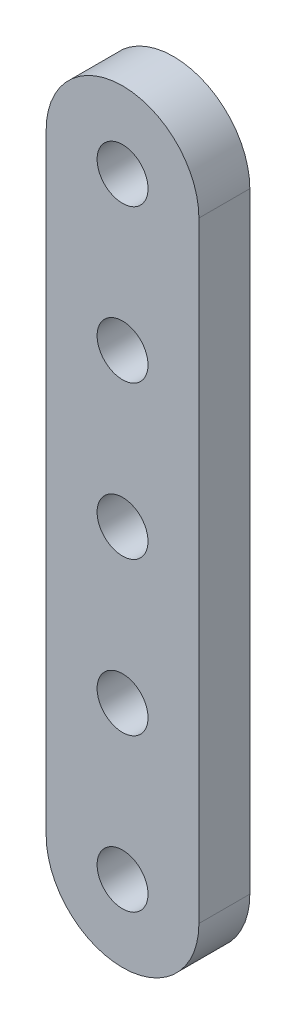
ISO-10303-21;
HEADER;
FILE_DESCRIPTION(('STEP AP214'),'2;1');
FILE_NAME('part.step','',(''),(''),'','','');
FILE_SCHEMA(('AUTOMOTIVE_DESIGN { 1 0 10303 214 1 1 1 1 }'));
ENDSEC;
DATA;
#1=APPLICATION_CONTEXT('core data for automotive mechanical design processes');
#2=APPLICATION_PROTOCOL_DEFINITION('international standard','automotive_design',2000,#1);
#3=PRODUCT_CONTEXT('',#1,'mechanical');
#4=PRODUCT('Part','Part','',(#3));
#5=PRODUCT_RELATED_PRODUCT_CATEGORY('part','',(#4));
#6=PRODUCT_DEFINITION_FORMATION('','',#4);
#7=PRODUCT_DEFINITION_CONTEXT('part definition',#1,'design');
#8=PRODUCT_DEFINITION('design','',#6,#7);
#9=PRODUCT_DEFINITION_SHAPE('','',#8);
#10=(LENGTH_UNIT() NAMED_UNIT(*) SI_UNIT(.MILLI.,.METRE.));
#11=(NAMED_UNIT(*) PLANE_ANGLE_UNIT() SI_UNIT($,.RADIAN.));
#12=(NAMED_UNIT(*) SI_UNIT($,.STERADIAN.) SOLID_ANGLE_UNIT());
#13=UNCERTAINTY_MEASURE_WITH_UNIT(LENGTH_MEASURE(1.E-05),#10,'distance_accuracy_value','');
#14=(GEOMETRIC_REPRESENTATION_CONTEXT(3) GLOBAL_UNCERTAINTY_ASSIGNED_CONTEXT((#13)) GLOBAL_UNIT_ASSIGNED_CONTEXT((#10,
#11,#12)) REPRESENTATION_CONTEXT('',''));
#15=CARTESIAN_POINT('',(0.,0.,0.));
#16=DIRECTION('',(0.,0.,1.));
#17=DIRECTION('',(1.,0.,0.));
#18=AXIS2_PLACEMENT_3D('',#15,#16,#17);
#19=CARTESIAN_POINT('',(208.7507761496,152.428489513,3.));
#20=DIRECTION('',(0.,0.,1.));
#21=DIRECTION('',(1.,0.,0.));
#22=AXIS2_PLACEMENT_3D('',#19,#20,#21);
#23=PLANE('',#22);
#24=CARTESIAN_POINT('',(208.7507761496,161.428489513,3.));
#25=DIRECTION('',(0.,0.,1.));
#26=DIRECTION('',(1.,0.,0.));
#27=AXIS2_PLACEMENT_3D('',#24,#25,#26);
#28=CIRCLE('',#27,1.5);
#29=CARTESIAN_POINT('',(210.2507761496,161.428489513,3.));
#30=VERTEX_POINT('',#29);
#31=EDGE_CURVE('E127',#30,#30,#28,.T.);
#32=ORIENTED_EDGE('',*,*,#31,.F.);
#33=EDGE_LOOP('',(#32));
#34=FACE_BOUND('',#33,.T.);
#35=CARTESIAN_POINT('',(208.7507761496,188.428489513,3.));
#36=DIRECTION('',(0.,0.,1.));
#37=DIRECTION('',(1.,0.,0.));
#38=AXIS2_PLACEMENT_3D('',#35,#36,#37);
#39=CIRCLE('',#38,1.5);
#40=CARTESIAN_POINT('',(210.2507761496,188.428489513,3.));
#41=VERTEX_POINT('',#40);
#42=EDGE_CURVE('E115',#41,#41,#39,.T.);
#43=ORIENTED_EDGE('',*,*,#42,.F.);
#44=EDGE_LOOP('',(#43));
#45=FACE_BOUND('',#44,.T.);
#46=CARTESIAN_POINT('',(208.7507761496,152.428489513,3.));
#47=DIRECTION('',(0.,0.,1.));
#48=DIRECTION('',(1.,0.,0.));
#49=AXIS2_PLACEMENT_3D('',#46,#47,#48);
#50=CIRCLE('',#49,4.5);
#51=CARTESIAN_POINT('',(204.2507761496,152.428489513,3.));
#52=VERTEX_POINT('',#51);
#53=CARTESIAN_POINT('',(213.2507761496,152.428489513,3.));
#54=VERTEX_POINT('',#53);
#55=EDGE_CURVE('E85',#52,#54,#50,.T.);
#56=ORIENTED_EDGE('',*,*,#55,.T.);
#57=DIRECTION('',(0.,1.,0.));
#58=VECTOR('',#57,1.);
#59=CARTESIAN_POINT('',(213.2507761496,152.428489513,3.));
#60=LINE('',#59,#58);
#61=CARTESIAN_POINT('',(213.2507761496,188.428489513,3.));
#62=VERTEX_POINT('',#61);
#63=EDGE_CURVE('E80',#54,#62,#60,.T.);
#64=ORIENTED_EDGE('',*,*,#63,.T.);
#65=CARTESIAN_POINT('',(208.7507761496,188.428489513,3.));
#66=DIRECTION('',(0.,0.,1.));
#67=DIRECTION('',(1.,0.,0.));
#68=AXIS2_PLACEMENT_3D('',#65,#66,#67);
#69=CIRCLE('',#68,4.5);
#70=CARTESIAN_POINT('',(204.2507761496,188.428489513,3.));
#71=VERTEX_POINT('',#70);
#72=EDGE_CURVE('E83',#62,#71,#69,.T.);
#73=ORIENTED_EDGE('',*,*,#72,.T.);
#74=DIRECTION('',(0.,-1.,0.));
#75=VECTOR('',#74,1.);
#76=CARTESIAN_POINT('',(204.2507761496,188.428489513,3.));
#77=LINE('',#76,#75);
#78=EDGE_CURVE('E50',#71,#52,#77,.T.);
#79=ORIENTED_EDGE('',*,*,#78,.T.);
#80=EDGE_LOOP('',(#56,#64,#73,#79));
#81=FACE_BOUND('',#80,.T.);
#82=CARTESIAN_POINT('',(208.7507761496,179.428489513,3.));
#83=DIRECTION('',(0.,0.,1.));
#84=DIRECTION('',(1.,0.,0.));
#85=AXIS2_PLACEMENT_3D('',#82,#83,#84);
#86=CIRCLE('',#85,1.5);
#87=CARTESIAN_POINT('',(210.2507761496,179.428489513,3.));
#88=VERTEX_POINT('',#87);
#89=EDGE_CURVE('E100',#88,#88,#86,.T.);
#90=ORIENTED_EDGE('',*,*,#89,.F.);
#91=EDGE_LOOP('',(#90));
#92=FACE_BOUND('',#91,.T.);
#93=CARTESIAN_POINT('',(208.7507761496,152.428489513,3.));
#94=DIRECTION('',(0.,0.,1.));
#95=DIRECTION('',(1.,0.,0.));
#96=AXIS2_PLACEMENT_3D('',#93,#94,#95);
#97=CIRCLE('',#96,1.5);
#98=CARTESIAN_POINT('',(210.2507761496,152.428489513,3.));
#99=VERTEX_POINT('',#98);
#100=EDGE_CURVE('E121',#99,#99,#97,.T.);
#101=ORIENTED_EDGE('',*,*,#100,.F.);
#102=EDGE_LOOP('',(#101));
#103=FACE_BOUND('',#102,.T.);
#104=CARTESIAN_POINT('',(208.7507761496,170.428489513,3.));
#105=DIRECTION('',(0.,0.,1.));
#106=DIRECTION('',(1.,0.,0.));
#107=AXIS2_PLACEMENT_3D('',#104,#105,#106);
#108=CIRCLE('',#107,1.5);
#109=CARTESIAN_POINT('',(210.2507761496,170.428489513,3.));
#110=VERTEX_POINT('',#109);
#111=EDGE_CURVE('E133',#110,#110,#108,.T.);
#112=ORIENTED_EDGE('',*,*,#111,.F.);
#113=EDGE_LOOP('',(#112));
#114=FACE_BOUND('',#113,.T.);
#115=ADVANCED_FACE('F33',(#34,#45,#81,#92,#103,#114),#23,.T.);
#116=CARTESIAN_POINT('',(208.7507761496,152.428489513,0.));
#117=DIRECTION('',(0.,0.,1.));
#118=DIRECTION('',(1.,0.,0.));
#119=AXIS2_PLACEMENT_3D('',#116,#117,#118);
#120=PLANE('',#119);
#121=CARTESIAN_POINT('',(208.7507761496,161.428489513,0.));
#122=DIRECTION('',(0.,0.,1.));
#123=DIRECTION('',(1.,0.,0.));
#124=AXIS2_PLACEMENT_3D('',#121,#122,#123);
#125=CIRCLE('',#124,1.5);
#126=CARTESIAN_POINT('',(210.2507761496,161.428489513,0.));
#127=VERTEX_POINT('',#126);
#128=EDGE_CURVE('E130',#127,#127,#125,.T.);
#129=ORIENTED_EDGE('',*,*,#128,.T.);
#130=EDGE_LOOP('',(#129));
#131=FACE_BOUND('',#130,.T.);
#132=CARTESIAN_POINT('',(208.7507761496,188.428489513,0.));
#133=DIRECTION('',(0.,0.,1.));
#134=DIRECTION('',(1.,0.,0.));
#135=AXIS2_PLACEMENT_3D('',#132,#133,#134);
#136=CIRCLE('',#135,1.5);
#137=CARTESIAN_POINT('',(210.2507761496,188.428489513,0.));
#138=VERTEX_POINT('',#137);
#139=EDGE_CURVE('E118',#138,#138,#136,.T.);
#140=ORIENTED_EDGE('',*,*,#139,.T.);
#141=EDGE_LOOP('',(#140));
#142=FACE_BOUND('',#141,.T.);
#143=CARTESIAN_POINT('',(208.7507761496,152.428489513,0.));
#144=DIRECTION('',(0.,0.,1.));
#145=DIRECTION('',(1.,0.,0.));
#146=AXIS2_PLACEMENT_3D('',#143,#144,#145);
#147=CIRCLE('',#146,4.5);
#148=CARTESIAN_POINT('',(204.2507761496,152.428489513,0.));
#149=VERTEX_POINT('',#148);
#150=CARTESIAN_POINT('',(213.2507761496,152.428489513,0.));
#151=VERTEX_POINT('',#150);
#152=EDGE_CURVE('E97',#149,#151,#147,.T.);
#153=ORIENTED_EDGE('',*,*,#152,.F.);
#154=DIRECTION('',(0.,-1.,0.));
#155=VECTOR('',#154,1.);
#156=CARTESIAN_POINT('',(204.2507761496,188.428489513,0.));
#157=LINE('',#156,#155);
#158=CARTESIAN_POINT('',(204.2507761496,188.428489513,0.));
#159=VERTEX_POINT('',#158);
#160=EDGE_CURVE('E73',#159,#149,#157,.T.);
#161=ORIENTED_EDGE('',*,*,#160,.F.);
#162=CARTESIAN_POINT('',(208.7507761496,188.428489513,0.));
#163=DIRECTION('',(0.,0.,1.));
#164=DIRECTION('',(1.,0.,0.));
#165=AXIS2_PLACEMENT_3D('',#162,#163,#164);
#166=CIRCLE('',#165,4.5);
#167=CARTESIAN_POINT('',(213.2507761496,188.428489513,0.));
#168=VERTEX_POINT('',#167);
#169=EDGE_CURVE('E67',#168,#159,#166,.T.);
#170=ORIENTED_EDGE('',*,*,#169,.F.);
#171=DIRECTION('',(0.,1.,0.));
#172=VECTOR('',#171,1.);
#173=CARTESIAN_POINT('',(213.2507761496,152.428489513,0.));
#174=LINE('',#173,#172);
#175=EDGE_CURVE('E89',#151,#168,#174,.T.);
#176=ORIENTED_EDGE('',*,*,#175,.F.);
#177=EDGE_LOOP('',(#153,#161,#170,#176));
#178=FACE_BOUND('',#177,.T.);
#179=CARTESIAN_POINT('',(208.7507761496,179.428489513,0.));
#180=DIRECTION('',(0.,0.,1.));
#181=DIRECTION('',(1.,0.,0.));
#182=AXIS2_PLACEMENT_3D('',#179,#180,#181);
#183=CIRCLE('',#182,1.5);
#184=CARTESIAN_POINT('',(210.2507761496,179.428489513,0.));
#185=VERTEX_POINT('',#184);
#186=EDGE_CURVE('E112',#185,#185,#183,.T.);
#187=ORIENTED_EDGE('',*,*,#186,.T.);
#188=EDGE_LOOP('',(#187));
#189=FACE_BOUND('',#188,.T.);
#190=CARTESIAN_POINT('',(208.7507761496,152.428489513,0.));
#191=DIRECTION('',(0.,0.,1.));
#192=DIRECTION('',(1.,0.,0.));
#193=AXIS2_PLACEMENT_3D('',#190,#191,#192);
#194=CIRCLE('',#193,1.5);
#195=CARTESIAN_POINT('',(210.2507761496,152.428489513,0.));
#196=VERTEX_POINT('',#195);
#197=EDGE_CURVE('E124',#196,#196,#194,.T.);
#198=ORIENTED_EDGE('',*,*,#197,.T.);
#199=EDGE_LOOP('',(#198));
#200=FACE_BOUND('',#199,.T.);
#201=CARTESIAN_POINT('',(208.7507761496,170.428489513,0.));
#202=DIRECTION('',(0.,0.,1.));
#203=DIRECTION('',(1.,0.,0.));
#204=AXIS2_PLACEMENT_3D('',#201,#202,#203);
#205=CIRCLE('',#204,1.5);
#206=CARTESIAN_POINT('',(210.2507761496,170.428489513,0.));
#207=VERTEX_POINT('',#206);
#208=EDGE_CURVE('E136',#207,#207,#205,.T.);
#209=ORIENTED_EDGE('',*,*,#208,.T.);
#210=EDGE_LOOP('',(#209));
#211=FACE_BOUND('',#210,.T.);
#212=ADVANCED_FACE('F108',(#131,#142,#178,#189,#200,#211),#120,.F.);
#213=CARTESIAN_POINT('',(208.7507761496,152.428489513,3.));
#214=DIRECTION('',(0.,0.,-1.));
#215=DIRECTION('',(-1.,0.,0.));
#216=AXIS2_PLACEMENT_3D('',#213,#214,#215);
#217=CYLINDRICAL_SURFACE('',#216,4.5);
#218=ORIENTED_EDGE('',*,*,#152,.T.);
#219=DIRECTION('',(0.,0.,-1.));
#220=VECTOR('',#219,1.);
#221=CARTESIAN_POINT('',(213.2507761496,152.428489513,3.));
#222=LINE('',#221,#220);
#223=EDGE_CURVE('E11',#54,#151,#222,.T.);
#224=ORIENTED_EDGE('',*,*,#223,.F.);
#225=ORIENTED_EDGE('',*,*,#55,.F.);
#226=DIRECTION('',(0.,0.,-1.));
#227=VECTOR('',#226,1.);
#228=CARTESIAN_POINT('',(204.2507761496,152.428489513,3.));
#229=LINE('',#228,#227);
#230=EDGE_CURVE('E93',#52,#149,#229,.T.);
#231=ORIENTED_EDGE('',*,*,#230,.T.);
#232=EDGE_LOOP('',(#218,#224,#225,#231));
#233=FACE_BOUND('',#232,.T.);
#234=ADVANCED_FACE('F35',(#233),#217,.T.);
#235=CARTESIAN_POINT('',(213.2507761496,152.428489513,3.));
#236=DIRECTION('',(-1.,0.,0.));
#237=DIRECTION('',(0.,0.,1.));
#238=AXIS2_PLACEMENT_3D('',#235,#236,#237);
#239=PLANE('',#238);
#240=ORIENTED_EDGE('',*,*,#175,.T.);
#241=DIRECTION('',(0.,0.,-1.));
#242=VECTOR('',#241,1.);
#243=CARTESIAN_POINT('',(213.2507761496,188.428489513,3.));
#244=LINE('',#243,#242);
#245=EDGE_CURVE('E42',#62,#168,#244,.T.);
#246=ORIENTED_EDGE('',*,*,#245,.F.);
#247=ORIENTED_EDGE('',*,*,#63,.F.);
#248=ORIENTED_EDGE('',*,*,#223,.T.);
#249=EDGE_LOOP('',(#240,#246,#247,#248));
#250=FACE_BOUND('',#249,.T.);
#251=ADVANCED_FACE('F88',(#250),#239,.F.);
#252=CARTESIAN_POINT('',(208.7507761496,188.428489513,3.));
#253=DIRECTION('',(0.,0.,-1.));
#254=DIRECTION('',(-1.,0.,0.));
#255=AXIS2_PLACEMENT_3D('',#252,#253,#254);
#256=CYLINDRICAL_SURFACE('',#255,4.5);
#257=ORIENTED_EDGE('',*,*,#169,.T.);
#258=DIRECTION('',(0.,0.,-1.));
#259=VECTOR('',#258,1.);
#260=CARTESIAN_POINT('',(204.2507761496,188.428489513,3.));
#261=LINE('',#260,#259);
#262=EDGE_CURVE('E90',#71,#159,#261,.T.);
#263=ORIENTED_EDGE('',*,*,#262,.F.);
#264=ORIENTED_EDGE('',*,*,#72,.F.);
#265=ORIENTED_EDGE('',*,*,#245,.T.);
#266=EDGE_LOOP('',(#257,#263,#264,#265));
#267=FACE_BOUND('',#266,.T.);
#268=ADVANCED_FACE('F91',(#267),#256,.T.);
#269=CARTESIAN_POINT('',(204.2507761496,188.428489513,3.));
#270=DIRECTION('',(1.,0.,0.));
#271=DIRECTION('',(0.,0.,-1.));
#272=AXIS2_PLACEMENT_3D('',#269,#270,#271);
#273=PLANE('',#272);
#274=ORIENTED_EDGE('',*,*,#160,.T.);
#275=ORIENTED_EDGE('',*,*,#230,.F.);
#276=ORIENTED_EDGE('',*,*,#78,.F.);
#277=ORIENTED_EDGE('',*,*,#262,.T.);
#278=EDGE_LOOP('',(#274,#275,#276,#277));
#279=FACE_BOUND('',#278,.T.);
#280=ADVANCED_FACE('F105',(#279),#273,.F.);
#281=CARTESIAN_POINT('',(208.7507761496,179.428489513,3.));
#282=DIRECTION('',(0.,0.,-1.));
#283=DIRECTION('',(-1.,0.,0.));
#284=AXIS2_PLACEMENT_3D('',#281,#282,#283);
#285=CYLINDRICAL_SURFACE('',#284,1.5);
#286=ORIENTED_EDGE('',*,*,#89,.T.);
#287=EDGE_LOOP('',(#286));
#288=FACE_BOUND('',#287,.T.);
#289=ORIENTED_EDGE('',*,*,#186,.F.);
#290=EDGE_LOOP('',(#289));
#291=FACE_BOUND('',#290,.T.);
#292=ADVANCED_FACE('F156',(#288,#291),#285,.F.);
#293=CARTESIAN_POINT('',(208.7507761496,188.428489513,3.));
#294=DIRECTION('',(0.,0.,-1.));
#295=DIRECTION('',(-1.,0.,0.));
#296=AXIS2_PLACEMENT_3D('',#293,#294,#295);
#297=CYLINDRICAL_SURFACE('',#296,1.5);
#298=ORIENTED_EDGE('',*,*,#42,.T.);
#299=EDGE_LOOP('',(#298));
#300=FACE_BOUND('',#299,.T.);
#301=ORIENTED_EDGE('',*,*,#139,.F.);
#302=EDGE_LOOP('',(#301));
#303=FACE_BOUND('',#302,.T.);
#304=ADVANCED_FACE('F202',(#300,#303),#297,.F.);
#305=CARTESIAN_POINT('',(208.7507761496,152.428489513,3.));
#306=DIRECTION('',(0.,0.,-1.));
#307=DIRECTION('',(-1.,0.,0.));
#308=AXIS2_PLACEMENT_3D('',#305,#306,#307);
#309=CYLINDRICAL_SURFACE('',#308,1.5);
#310=ORIENTED_EDGE('',*,*,#100,.T.);
#311=EDGE_LOOP('',(#310));
#312=FACE_BOUND('',#311,.T.);
#313=ORIENTED_EDGE('',*,*,#197,.F.);
#314=EDGE_LOOP('',(#313));
#315=FACE_BOUND('',#314,.T.);
#316=ADVANCED_FACE('F210',(#312,#315),#309,.F.);
#317=CARTESIAN_POINT('',(208.7507761496,161.428489513,3.));
#318=DIRECTION('',(0.,0.,-1.));
#319=DIRECTION('',(-1.,0.,0.));
#320=AXIS2_PLACEMENT_3D('',#317,#318,#319);
#321=CYLINDRICAL_SURFACE('',#320,1.5);
#322=ORIENTED_EDGE('',*,*,#31,.T.);
#323=EDGE_LOOP('',(#322));
#324=FACE_BOUND('',#323,.T.);
#325=ORIENTED_EDGE('',*,*,#128,.F.);
#326=EDGE_LOOP('',(#325));
#327=FACE_BOUND('',#326,.T.);
#328=ADVANCED_FACE('F218',(#324,#327),#321,.F.);
#329=CARTESIAN_POINT('',(208.7507761496,170.428489513,3.));
#330=DIRECTION('',(0.,0.,-1.));
#331=DIRECTION('',(-1.,0.,0.));
#332=AXIS2_PLACEMENT_3D('',#329,#330,#331);
#333=CYLINDRICAL_SURFACE('',#332,1.5);
#334=ORIENTED_EDGE('',*,*,#111,.T.);
#335=EDGE_LOOP('',(#334));
#336=FACE_BOUND('',#335,.T.);
#337=ORIENTED_EDGE('',*,*,#208,.F.);
#338=EDGE_LOOP('',(#337));
#339=FACE_BOUND('',#338,.T.);
#340=ADVANCED_FACE('F142',(#336,#339),#333,.F.);
#341=CLOSED_SHELL('',(#115,#212,#234,#251,#268,#280,#292,#304,#316,#328,#340));
#342=MANIFOLD_SOLID_BREP('B2',#341);
#343=ADVANCED_BREP_SHAPE_REPRESENTATION('',(#18,#342),#14);
#344=SHAPE_DEFINITION_REPRESENTATION(#9,#343);
ENDSEC;
END-ISO-10303-21;
